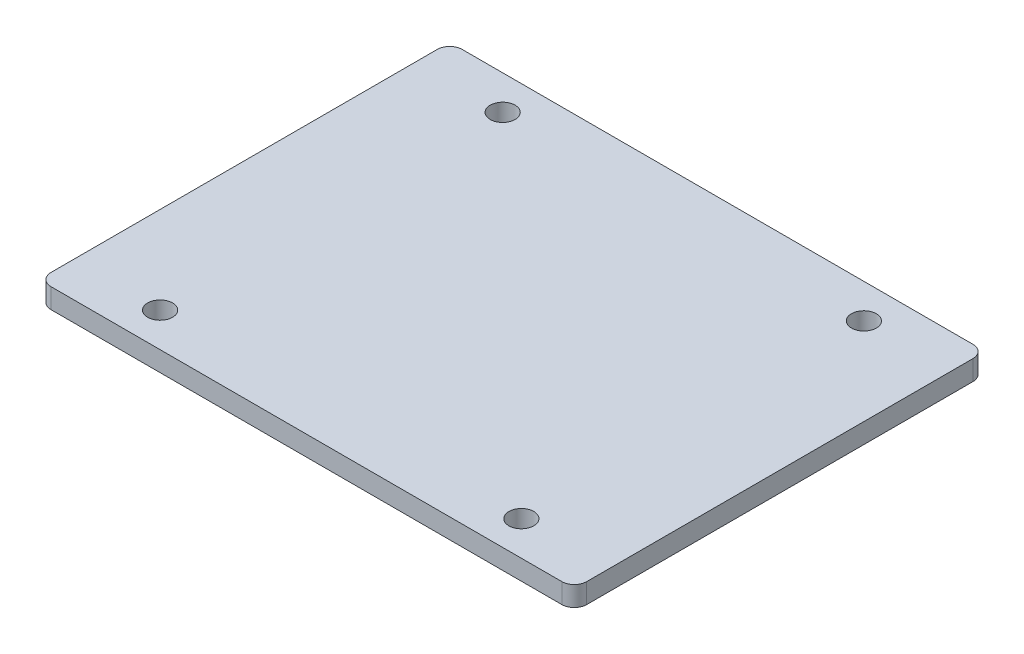
ISO-10303-21;
HEADER;
FILE_DESCRIPTION(('STEP AP214'),'2;1');
FILE_NAME('part.step','',(''),(''),'','','');
FILE_SCHEMA(('AUTOMOTIVE_DESIGN { 1 0 10303 214 1 1 1 1 }'));
ENDSEC;
DATA;
#1=APPLICATION_CONTEXT('core data for automotive mechanical design processes');
#2=APPLICATION_PROTOCOL_DEFINITION('international standard','automotive_design',2000,#1);
#3=PRODUCT_CONTEXT('',#1,'mechanical');
#4=PRODUCT('Part','Part','',(#3));
#5=PRODUCT_RELATED_PRODUCT_CATEGORY('part','',(#4));
#6=PRODUCT_DEFINITION_FORMATION('','',#4);
#7=PRODUCT_DEFINITION_CONTEXT('part definition',#1,'design');
#8=PRODUCT_DEFINITION('design','',#6,#7);
#9=PRODUCT_DEFINITION_SHAPE('','',#8);
#10=(LENGTH_UNIT() NAMED_UNIT(*) SI_UNIT(.MILLI.,.METRE.));
#11=(NAMED_UNIT(*) PLANE_ANGLE_UNIT() SI_UNIT($,.RADIAN.));
#12=(NAMED_UNIT(*) SI_UNIT($,.STERADIAN.) SOLID_ANGLE_UNIT());
#13=UNCERTAINTY_MEASURE_WITH_UNIT(LENGTH_MEASURE(1.E-05),#10,'distance_accuracy_value','');
#14=(GEOMETRIC_REPRESENTATION_CONTEXT(3) GLOBAL_UNCERTAINTY_ASSIGNED_CONTEXT((#13)) GLOBAL_UNIT_ASSIGNED_CONTEXT((#10,
#11,#12)) REPRESENTATION_CONTEXT('',''));
#15=CARTESIAN_POINT('',(0.,0.,0.));
#16=DIRECTION('',(0.,0.,1.));
#17=DIRECTION('',(1.,0.,0.));
#18=AXIS2_PLACEMENT_3D('',#15,#16,#17);
#19=CARTESIAN_POINT('',(-20.5,1.6,15.5));
#20=DIRECTION('',(0.,-1.,0.));
#21=DIRECTION('',(0.,0.,-1.));
#22=AXIS2_PLACEMENT_3D('',#19,#20,#21);
#23=CYLINDRICAL_SURFACE('',#22,1.);
#24=CARTESIAN_POINT('',(-20.5,0.,15.5));
#25=DIRECTION('',(0.,1.,0.));
#26=DIRECTION('',(0.,0.,-1.));
#27=AXIS2_PLACEMENT_3D('',#24,#25,#26);
#28=CIRCLE('',#27,1.);
#29=CARTESIAN_POINT('',(-21.5,0.,15.5));
#30=VERTEX_POINT('',#29);
#31=CARTESIAN_POINT('',(-20.5,0.,16.5));
#32=VERTEX_POINT('',#31);
#33=EDGE_CURVE('E132',#30,#32,#28,.T.);
#34=ORIENTED_EDGE('',*,*,#33,.T.);
#35=DIRECTION('',(0.,-1.,0.));
#36=VECTOR('',#35,1.);
#37=CARTESIAN_POINT('',(-20.5,1.6,16.5));
#38=LINE('',#37,#36);
#39=CARTESIAN_POINT('',(-20.5,1.6,16.5));
#40=VERTEX_POINT('',#39);
#41=EDGE_CURVE('E11',#40,#32,#38,.T.);
#42=ORIENTED_EDGE('',*,*,#41,.F.);
#43=CARTESIAN_POINT('',(-20.5,1.6,15.5));
#44=DIRECTION('',(0.,1.,0.));
#45=DIRECTION('',(0.,0.,-1.));
#46=AXIS2_PLACEMENT_3D('',#43,#44,#45);
#47=CIRCLE('',#46,1.);
#48=CARTESIAN_POINT('',(-21.5,1.6,15.5));
#49=VERTEX_POINT('',#48);
#50=EDGE_CURVE('E147',#49,#40,#47,.T.);
#51=ORIENTED_EDGE('',*,*,#50,.F.);
#52=DIRECTION('',(0.,-1.,0.));
#53=VECTOR('',#52,1.);
#54=CARTESIAN_POINT('',(-21.5,1.6,15.5));
#55=LINE('',#54,#53);
#56=EDGE_CURVE('E128',#49,#30,#55,.T.);
#57=ORIENTED_EDGE('',*,*,#56,.T.);
#58=EDGE_LOOP('',(#34,#42,#51,#57));
#59=FACE_BOUND('',#58,.T.);
#60=ADVANCED_FACE('F36',(#59),#23,.T.);
#61=CARTESIAN_POINT('',(-20.5,1.6,16.5));
#62=DIRECTION('',(0.,0.,-1.));
#63=DIRECTION('',(-1.,0.,0.));
#64=AXIS2_PLACEMENT_3D('',#61,#62,#63);
#65=PLANE('',#64);
#66=DIRECTION('',(1.,0.,0.));
#67=VECTOR('',#66,1.);
#68=CARTESIAN_POINT('',(-20.5,0.,16.5));
#69=LINE('',#68,#67);
#70=CARTESIAN_POINT('',(20.5,0.,16.5));
#71=VERTEX_POINT('',#70);
#72=EDGE_CURVE('E135',#32,#71,#69,.T.);
#73=ORIENTED_EDGE('',*,*,#72,.T.);
#74=DIRECTION('',(0.,-1.,0.));
#75=VECTOR('',#74,1.);
#76=CARTESIAN_POINT('',(20.5,1.6,16.5));
#77=LINE('',#76,#75);
#78=CARTESIAN_POINT('',(20.5,1.6,16.5));
#79=VERTEX_POINT('',#78);
#80=EDGE_CURVE('E44',#79,#71,#77,.T.);
#81=ORIENTED_EDGE('',*,*,#80,.F.);
#82=DIRECTION('',(1.,0.,0.));
#83=VECTOR('',#82,1.);
#84=CARTESIAN_POINT('',(-20.5,1.6,16.5));
#85=LINE('',#84,#83);
#86=EDGE_CURVE('E95',#40,#79,#85,.T.);
#87=ORIENTED_EDGE('',*,*,#86,.F.);
#88=ORIENTED_EDGE('',*,*,#41,.T.);
#89=EDGE_LOOP('',(#73,#81,#87,#88));
#90=FACE_BOUND('',#89,.T.);
#91=ADVANCED_FACE('F232',(#90),#65,.F.);
#92=CARTESIAN_POINT('',(20.5,1.6,15.5));
#93=DIRECTION('',(0.,-1.,0.));
#94=DIRECTION('',(0.,0.,-1.));
#95=AXIS2_PLACEMENT_3D('',#92,#93,#94);
#96=CYLINDRICAL_SURFACE('',#95,1.);
#97=CARTESIAN_POINT('',(20.5,0.,15.5));
#98=DIRECTION('',(0.,1.,0.));
#99=DIRECTION('',(0.,0.,1.));
#100=AXIS2_PLACEMENT_3D('',#97,#98,#99);
#101=CIRCLE('',#100,1.);
#102=CARTESIAN_POINT('',(21.5,0.,15.5));
#103=VERTEX_POINT('',#102);
#104=EDGE_CURVE('E138',#71,#103,#101,.T.);
#105=ORIENTED_EDGE('',*,*,#104,.T.);
#106=DIRECTION('',(0.,-1.,0.));
#107=VECTOR('',#106,1.);
#108=CARTESIAN_POINT('',(21.5,1.6,15.5));
#109=LINE('',#108,#107);
#110=CARTESIAN_POINT('',(21.5,1.6,15.5));
#111=VERTEX_POINT('',#110);
#112=EDGE_CURVE('E154',#111,#103,#109,.T.);
#113=ORIENTED_EDGE('',*,*,#112,.F.);
#114=CARTESIAN_POINT('',(20.5,1.6,15.5));
#115=DIRECTION('',(0.,1.,0.));
#116=DIRECTION('',(0.,0.,1.));
#117=AXIS2_PLACEMENT_3D('',#114,#115,#116);
#118=CIRCLE('',#117,1.);
#119=EDGE_CURVE('E162',#79,#111,#118,.T.);
#120=ORIENTED_EDGE('',*,*,#119,.F.);
#121=ORIENTED_EDGE('',*,*,#80,.T.);
#122=EDGE_LOOP('',(#105,#113,#120,#121));
#123=FACE_BOUND('',#122,.T.);
#124=ADVANCED_FACE('F160',(#123),#96,.T.);
#125=CARTESIAN_POINT('',(21.5,1.6,15.5));
#126=DIRECTION('',(-1.,0.,0.));
#127=DIRECTION('',(0.,0.,1.));
#128=AXIS2_PLACEMENT_3D('',#125,#126,#127);
#129=PLANE('',#128);
#130=DIRECTION('',(0.,0.,-1.));
#131=VECTOR('',#130,1.);
#132=CARTESIAN_POINT('',(21.5,0.,15.5));
#133=LINE('',#132,#131);
#134=CARTESIAN_POINT('',(21.5,0.,-15.5));
#135=VERTEX_POINT('',#134);
#136=EDGE_CURVE('E140',#103,#135,#133,.T.);
#137=ORIENTED_EDGE('',*,*,#136,.T.);
#138=DIRECTION('',(0.,-1.,0.));
#139=VECTOR('',#138,1.);
#140=CARTESIAN_POINT('',(21.5,1.6,-15.5));
#141=LINE('',#140,#139);
#142=CARTESIAN_POINT('',(21.5,1.6,-15.5));
#143=VERTEX_POINT('',#142);
#144=EDGE_CURVE('E151',#143,#135,#141,.T.);
#145=ORIENTED_EDGE('',*,*,#144,.F.);
#146=DIRECTION('',(0.,0.,-1.));
#147=VECTOR('',#146,1.);
#148=CARTESIAN_POINT('',(21.5,1.6,15.5));
#149=LINE('',#148,#147);
#150=EDGE_CURVE('E174',#111,#143,#149,.T.);
#151=ORIENTED_EDGE('',*,*,#150,.F.);
#152=ORIENTED_EDGE('',*,*,#112,.T.);
#153=EDGE_LOOP('',(#137,#145,#151,#152));
#154=FACE_BOUND('',#153,.T.);
#155=ADVANCED_FACE('F170',(#154),#129,.F.);
#156=CARTESIAN_POINT('',(20.5,1.6,-15.5));
#157=DIRECTION('',(0.,-1.,0.));
#158=DIRECTION('',(0.,0.,-1.));
#159=AXIS2_PLACEMENT_3D('',#156,#157,#158);
#160=CYLINDRICAL_SURFACE('',#159,1.);
#161=CARTESIAN_POINT('',(20.5,0.,-15.5));
#162=DIRECTION('',(0.,1.,0.));
#163=DIRECTION('',(0.,0.,-1.));
#164=AXIS2_PLACEMENT_3D('',#161,#162,#163);
#165=CIRCLE('',#164,1.);
#166=CARTESIAN_POINT('',(20.5,0.,-16.5));
#167=VERTEX_POINT('',#166);
#168=EDGE_CURVE('E142',#135,#167,#165,.T.);
#169=ORIENTED_EDGE('',*,*,#168,.T.);
#170=DIRECTION('',(0.,-1.,0.));
#171=VECTOR('',#170,1.);
#172=CARTESIAN_POINT('',(20.5,1.6,-16.5));
#173=LINE('',#172,#171);
#174=CARTESIAN_POINT('',(20.5,1.6,-16.5));
#175=VERTEX_POINT('',#174);
#176=EDGE_CURVE('E123',#175,#167,#173,.T.);
#177=ORIENTED_EDGE('',*,*,#176,.F.);
#178=CARTESIAN_POINT('',(20.5,1.6,-15.5));
#179=DIRECTION('',(0.,1.,0.));
#180=DIRECTION('',(0.,0.,-1.));
#181=AXIS2_PLACEMENT_3D('',#178,#179,#180);
#182=CIRCLE('',#181,1.);
#183=EDGE_CURVE('E114',#143,#175,#182,.T.);
#184=ORIENTED_EDGE('',*,*,#183,.F.);
#185=ORIENTED_EDGE('',*,*,#144,.T.);
#186=EDGE_LOOP('',(#169,#177,#184,#185));
#187=FACE_BOUND('',#186,.T.);
#188=ADVANCED_FACE('F173',(#187),#160,.T.);
#189=CARTESIAN_POINT('',(-20.5,1.6,-16.5));
#190=DIRECTION('',(0.,0.,1.));
#191=DIRECTION('',(1.,0.,0.));
#192=AXIS2_PLACEMENT_3D('',#189,#190,#191);
#193=PLANE('',#192);
#194=DIRECTION('',(-1.,0.,0.));
#195=VECTOR('',#194,1.);
#196=CARTESIAN_POINT('',(-20.5,0.,-16.5));
#197=LINE('',#196,#195);
#198=CARTESIAN_POINT('',(-20.5,0.,-16.5));
#199=VERTEX_POINT('',#198);
#200=EDGE_CURVE('E122',#167,#199,#197,.T.);
#201=ORIENTED_EDGE('',*,*,#200,.T.);
#202=DIRECTION('',(0.,-1.,0.));
#203=VECTOR('',#202,1.);
#204=CARTESIAN_POINT('',(-20.5,1.6,-16.5));
#205=LINE('',#204,#203);
#206=CARTESIAN_POINT('',(-20.5,1.6,-16.5));
#207=VERTEX_POINT('',#206);
#208=EDGE_CURVE('E119',#207,#199,#205,.T.);
#209=ORIENTED_EDGE('',*,*,#208,.F.);
#210=DIRECTION('',(-1.,0.,0.));
#211=VECTOR('',#210,1.);
#212=CARTESIAN_POINT('',(-20.5,1.6,-16.5));
#213=LINE('',#212,#211);
#214=EDGE_CURVE('E108',#175,#207,#213,.T.);
#215=ORIENTED_EDGE('',*,*,#214,.F.);
#216=ORIENTED_EDGE('',*,*,#176,.T.);
#217=EDGE_LOOP('',(#201,#209,#215,#216));
#218=FACE_BOUND('',#217,.T.);
#219=ADVANCED_FACE('F120',(#218),#193,.F.);
#220=CARTESIAN_POINT('',(-20.5,1.6,-15.5));
#221=DIRECTION('',(0.,-1.,0.));
#222=DIRECTION('',(0.,0.,-1.));
#223=AXIS2_PLACEMENT_3D('',#220,#221,#222);
#224=CYLINDRICAL_SURFACE('',#223,1.);
#225=CARTESIAN_POINT('',(-20.5,0.,-15.5));
#226=DIRECTION('',(0.,1.,0.));
#227=DIRECTION('',(0.,0.,-1.));
#228=AXIS2_PLACEMENT_3D('',#225,#226,#227);
#229=CIRCLE('',#228,1.);
#230=CARTESIAN_POINT('',(-21.5,0.,-15.5));
#231=VERTEX_POINT('',#230);
#232=EDGE_CURVE('E81',#199,#231,#229,.T.);
#233=ORIENTED_EDGE('',*,*,#232,.T.);
#234=DIRECTION('',(0.,-1.,0.));
#235=VECTOR('',#234,1.);
#236=CARTESIAN_POINT('',(-21.5,1.6,-15.5));
#237=LINE('',#236,#235);
#238=CARTESIAN_POINT('',(-21.5,1.6,-15.5));
#239=VERTEX_POINT('',#238);
#240=EDGE_CURVE('E124',#239,#231,#237,.T.);
#241=ORIENTED_EDGE('',*,*,#240,.F.);
#242=CARTESIAN_POINT('',(-20.5,1.6,-15.5));
#243=DIRECTION('',(0.,1.,0.));
#244=DIRECTION('',(0.,0.,-1.));
#245=AXIS2_PLACEMENT_3D('',#242,#243,#244);
#246=CIRCLE('',#245,1.);
#247=EDGE_CURVE('E112',#207,#239,#246,.T.);
#248=ORIENTED_EDGE('',*,*,#247,.F.);
#249=ORIENTED_EDGE('',*,*,#208,.T.);
#250=EDGE_LOOP('',(#233,#241,#248,#249));
#251=FACE_BOUND('',#250,.T.);
#252=ADVANCED_FACE('F126',(#251),#224,.T.);
#253=CARTESIAN_POINT('',(-21.5,1.6,15.5));
#254=DIRECTION('',(1.,0.,0.));
#255=DIRECTION('',(0.,0.,-1.));
#256=AXIS2_PLACEMENT_3D('',#253,#254,#255);
#257=PLANE('',#256);
#258=DIRECTION('',(0.,0.,1.));
#259=VECTOR('',#258,1.);
#260=CARTESIAN_POINT('',(-21.5,0.,15.5));
#261=LINE('',#260,#259);
#262=EDGE_CURVE('E87',#231,#30,#261,.T.);
#263=ORIENTED_EDGE('',*,*,#262,.T.);
#264=ORIENTED_EDGE('',*,*,#56,.F.);
#265=DIRECTION('',(0.,0.,1.));
#266=VECTOR('',#265,1.);
#267=CARTESIAN_POINT('',(-21.5,1.6,15.5));
#268=LINE('',#267,#266);
#269=EDGE_CURVE('E52',#239,#49,#268,.T.);
#270=ORIENTED_EDGE('',*,*,#269,.F.);
#271=ORIENTED_EDGE('',*,*,#240,.T.);
#272=EDGE_LOOP('',(#263,#264,#270,#271));
#273=FACE_BOUND('',#272,.T.);
#274=ADVANCED_FACE('F208',(#273),#257,.F.);
#275=CARTESIAN_POINT('',(-20.5,1.6,15.5));
#276=DIRECTION('',(0.,-1.,0.));
#277=DIRECTION('',(0.,0.,-1.));
#278=AXIS2_PLACEMENT_3D('',#275,#276,#277);
#279=PLANE('',#278);
#280=CARTESIAN_POINT('',(-14.5000000000002,1.6,13.75));
#281=DIRECTION('',(0.,1.,0.));
#282=DIRECTION('',(0.,0.,1.));
#283=AXIS2_PLACEMENT_3D('',#280,#281,#282);
#284=CIRCLE('',#283,1.00000000000021);
#285=CARTESIAN_POINT('',(-14.5000000000002,1.6,14.7500000000002));
#286=VERTEX_POINT('',#285);
#287=EDGE_CURVE('E195',#286,#286,#284,.T.);
#288=ORIENTED_EDGE('',*,*,#287,.F.);
#289=EDGE_LOOP('',(#288));
#290=FACE_BOUND('',#289,.T.);
#291=CARTESIAN_POINT('',(14.4999999999998,1.6,13.75));
#292=DIRECTION('',(0.,1.,0.));
#293=DIRECTION('',(0.,0.,1.));
#294=AXIS2_PLACEMENT_3D('',#291,#292,#293);
#295=CIRCLE('',#294,1.00000000000021);
#296=CARTESIAN_POINT('',(14.4999999999998,1.6,14.7500000000002));
#297=VERTEX_POINT('',#296);
#298=EDGE_CURVE('E189',#297,#297,#295,.T.);
#299=ORIENTED_EDGE('',*,*,#298,.F.);
#300=EDGE_LOOP('',(#299));
#301=FACE_BOUND('',#300,.T.);
#302=CARTESIAN_POINT('',(14.4999999999998,1.6,-13.75));
#303=DIRECTION('',(0.,1.,0.));
#304=DIRECTION('',(0.,0.,1.));
#305=AXIS2_PLACEMENT_3D('',#302,#303,#304);
#306=CIRCLE('',#305,1.00000000000021);
#307=CARTESIAN_POINT('',(14.4999999999998,1.6,-12.7499999999998));
#308=VERTEX_POINT('',#307);
#309=EDGE_CURVE('E183',#308,#308,#306,.T.);
#310=ORIENTED_EDGE('',*,*,#309,.F.);
#311=EDGE_LOOP('',(#310));
#312=FACE_BOUND('',#311,.T.);
#313=CARTESIAN_POINT('',(-14.5000000000002,1.6,-13.75));
#314=DIRECTION('',(0.,1.,0.));
#315=DIRECTION('',(0.,0.,1.));
#316=AXIS2_PLACEMENT_3D('',#313,#314,#315);
#317=CIRCLE('',#316,1.00000000000022);
#318=CARTESIAN_POINT('',(-14.5000000000002,1.6,-12.7499999999998));
#319=VERTEX_POINT('',#318);
#320=EDGE_CURVE('E136',#319,#319,#317,.T.);
#321=ORIENTED_EDGE('',*,*,#320,.F.);
#322=EDGE_LOOP('',(#321));
#323=FACE_BOUND('',#322,.T.);
#324=ORIENTED_EDGE('',*,*,#50,.T.);
#325=ORIENTED_EDGE('',*,*,#86,.T.);
#326=ORIENTED_EDGE('',*,*,#119,.T.);
#327=ORIENTED_EDGE('',*,*,#150,.T.);
#328=ORIENTED_EDGE('',*,*,#183,.T.);
#329=ORIENTED_EDGE('',*,*,#214,.T.);
#330=ORIENTED_EDGE('',*,*,#247,.T.);
#331=ORIENTED_EDGE('',*,*,#269,.T.);
#332=EDGE_LOOP('',(#324,#325,#326,#327,#328,#329,#330,#331));
#333=FACE_BOUND('',#332,.T.);
#334=ADVANCED_FACE('F110',(#290,#301,#312,#323,#333),#279,.F.);
#335=CARTESIAN_POINT('',(-20.5,0.,15.5));
#336=DIRECTION('',(0.,-1.,0.));
#337=DIRECTION('',(0.,0.,-1.));
#338=AXIS2_PLACEMENT_3D('',#335,#336,#337);
#339=PLANE('',#338);
#340=CARTESIAN_POINT('',(-14.5000000000002,0.,13.75));
#341=DIRECTION('',(0.,-1.,0.));
#342=DIRECTION('',(0.,0.,-1.));
#343=AXIS2_PLACEMENT_3D('',#340,#341,#342);
#344=CIRCLE('',#343,1.00000000000021);
#345=CARTESIAN_POINT('',(-14.5000000000002,0.,12.7499999999998));
#346=VERTEX_POINT('',#345);
#347=EDGE_CURVE('E198',#346,#346,#344,.F.);
#348=ORIENTED_EDGE('',*,*,#347,.T.);
#349=EDGE_LOOP('',(#348));
#350=FACE_BOUND('',#349,.T.);
#351=CARTESIAN_POINT('',(14.4999999999998,0.,13.75));
#352=DIRECTION('',(0.,-1.,0.));
#353=DIRECTION('',(0.,0.,-1.));
#354=AXIS2_PLACEMENT_3D('',#351,#352,#353);
#355=CIRCLE('',#354,1.00000000000021);
#356=CARTESIAN_POINT('',(14.4999999999998,0.,12.7499999999998));
#357=VERTEX_POINT('',#356);
#358=EDGE_CURVE('E192',#357,#357,#355,.F.);
#359=ORIENTED_EDGE('',*,*,#358,.T.);
#360=EDGE_LOOP('',(#359));
#361=FACE_BOUND('',#360,.T.);
#362=CARTESIAN_POINT('',(14.4999999999998,0.,-13.75));
#363=DIRECTION('',(0.,-1.,0.));
#364=DIRECTION('',(0.,0.,-1.));
#365=AXIS2_PLACEMENT_3D('',#362,#363,#364);
#366=CIRCLE('',#365,1.00000000000021);
#367=CARTESIAN_POINT('',(14.4999999999998,0.,-14.7500000000002));
#368=VERTEX_POINT('',#367);
#369=EDGE_CURVE('E186',#368,#368,#366,.F.);
#370=ORIENTED_EDGE('',*,*,#369,.T.);
#371=EDGE_LOOP('',(#370));
#372=FACE_BOUND('',#371,.T.);
#373=CARTESIAN_POINT('',(-14.5000000000002,0.,-13.75));
#374=DIRECTION('',(0.,-1.,0.));
#375=DIRECTION('',(0.,0.,-1.));
#376=AXIS2_PLACEMENT_3D('',#373,#374,#375);
#377=CIRCLE('',#376,1.00000000000022);
#378=CARTESIAN_POINT('',(-14.5000000000002,0.,-14.7500000000002));
#379=VERTEX_POINT('',#378);
#380=EDGE_CURVE('E180',#379,#379,#377,.F.);
#381=ORIENTED_EDGE('',*,*,#380,.T.);
#382=EDGE_LOOP('',(#381));
#383=FACE_BOUND('',#382,.T.);
#384=ORIENTED_EDGE('',*,*,#33,.F.);
#385=ORIENTED_EDGE('',*,*,#262,.F.);
#386=ORIENTED_EDGE('',*,*,#232,.F.);
#387=ORIENTED_EDGE('',*,*,#200,.F.);
#388=ORIENTED_EDGE('',*,*,#168,.F.);
#389=ORIENTED_EDGE('',*,*,#136,.F.);
#390=ORIENTED_EDGE('',*,*,#104,.F.);
#391=ORIENTED_EDGE('',*,*,#72,.F.);
#392=EDGE_LOOP('',(#384,#385,#386,#387,#388,#389,#390,#391));
#393=FACE_BOUND('',#392,.T.);
#394=ADVANCED_FACE('F166',(#350,#361,#372,#383,#393),#339,.T.);
#395=CARTESIAN_POINT('',(-14.5000000000002,-0.000999999999999916,-13.75));
#396=DIRECTION('',(0.,1.,0.));
#397=DIRECTION('',(0.,0.,1.));
#398=AXIS2_PLACEMENT_3D('',#395,#396,#397);
#399=CYLINDRICAL_SURFACE('',#398,1.00000000000022);
#400=ORIENTED_EDGE('',*,*,#380,.F.);
#401=EDGE_LOOP('',(#400));
#402=FACE_BOUND('',#401,.T.);
#403=ORIENTED_EDGE('',*,*,#320,.T.);
#404=EDGE_LOOP('',(#403));
#405=FACE_BOUND('',#404,.T.);
#406=ADVANCED_FACE('F216',(#402,#405),#399,.F.);
#407=CARTESIAN_POINT('',(14.4999999999998,-0.000999999999999916,-13.75));
#408=DIRECTION('',(0.,1.,0.));
#409=DIRECTION('',(0.,0.,1.));
#410=AXIS2_PLACEMENT_3D('',#407,#408,#409);
#411=CYLINDRICAL_SURFACE('',#410,1.00000000000021);
#412=ORIENTED_EDGE('',*,*,#369,.F.);
#413=EDGE_LOOP('',(#412));
#414=FACE_BOUND('',#413,.T.);
#415=ORIENTED_EDGE('',*,*,#309,.T.);
#416=EDGE_LOOP('',(#415));
#417=FACE_BOUND('',#416,.T.);
#418=ADVANCED_FACE('F218',(#414,#417),#411,.F.);
#419=CARTESIAN_POINT('',(14.4999999999998,-0.000999999999999916,13.75));
#420=DIRECTION('',(0.,1.,0.));
#421=DIRECTION('',(0.,0.,1.));
#422=AXIS2_PLACEMENT_3D('',#419,#420,#421);
#423=CYLINDRICAL_SURFACE('',#422,1.00000000000021);
#424=ORIENTED_EDGE('',*,*,#358,.F.);
#425=EDGE_LOOP('',(#424));
#426=FACE_BOUND('',#425,.T.);
#427=ORIENTED_EDGE('',*,*,#298,.T.);
#428=EDGE_LOOP('',(#427));
#429=FACE_BOUND('',#428,.T.);
#430=ADVANCED_FACE('F225',(#426,#429),#423,.F.);
#431=CARTESIAN_POINT('',(-14.5000000000002,-0.000999999999999916,13.75));
#432=DIRECTION('',(0.,1.,0.));
#433=DIRECTION('',(0.,0.,1.));
#434=AXIS2_PLACEMENT_3D('',#431,#432,#433);
#435=CYLINDRICAL_SURFACE('',#434,1.00000000000021);
#436=ORIENTED_EDGE('',*,*,#347,.F.);
#437=EDGE_LOOP('',(#436));
#438=FACE_BOUND('',#437,.T.);
#439=ORIENTED_EDGE('',*,*,#287,.T.);
#440=EDGE_LOOP('',(#439));
#441=FACE_BOUND('',#440,.T.);
#442=ADVANCED_FACE('F204',(#438,#441),#435,.F.);
#443=CLOSED_SHELL('',(#60,#91,#124,#155,#188,#219,#252,#274,#334,#394,#406,#418,#430,#442));
#444=MANIFOLD_SOLID_BREP('B2',#443);
#445=ADVANCED_BREP_SHAPE_REPRESENTATION('',(#18,#444),#14);
#446=SHAPE_DEFINITION_REPRESENTATION(#9,#445);
ENDSEC;
END-ISO-10303-21;
